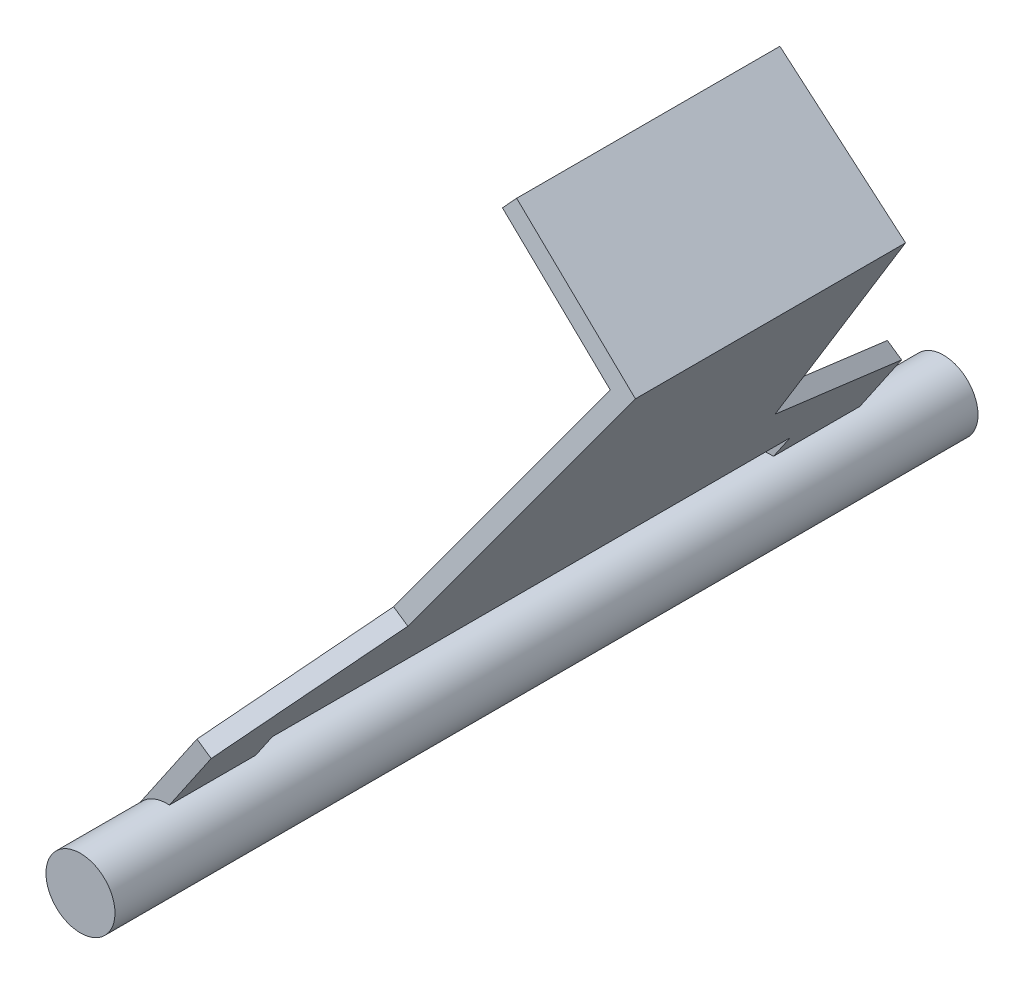
ISO-10303-21;
HEADER;
FILE_DESCRIPTION(('STEP AP214'),'2;1');
FILE_NAME('part.step','',(''),(''),'','','');
FILE_SCHEMA(('AUTOMOTIVE_DESIGN { 1 0 10303 214 1 1 1 1 }'));
ENDSEC;
DATA;
#1=APPLICATION_CONTEXT('core data for automotive mechanical design processes');
#2=APPLICATION_PROTOCOL_DEFINITION('international standard','automotive_design',2000,#1);
#3=PRODUCT_CONTEXT('',#1,'mechanical');
#4=PRODUCT('Part','Part','',(#3));
#5=PRODUCT_RELATED_PRODUCT_CATEGORY('part','',(#4));
#6=PRODUCT_DEFINITION_FORMATION('','',#4);
#7=PRODUCT_DEFINITION_CONTEXT('part definition',#1,'design');
#8=PRODUCT_DEFINITION('design','',#6,#7);
#9=PRODUCT_DEFINITION_SHAPE('','',#8);
#10=(LENGTH_UNIT() NAMED_UNIT(*) SI_UNIT(.MILLI.,.METRE.));
#11=(NAMED_UNIT(*) PLANE_ANGLE_UNIT() SI_UNIT($,.RADIAN.));
#12=(NAMED_UNIT(*) SI_UNIT($,.STERADIAN.) SOLID_ANGLE_UNIT());
#13=UNCERTAINTY_MEASURE_WITH_UNIT(LENGTH_MEASURE(1.E-05),#10,'distance_accuracy_value','');
#14=(GEOMETRIC_REPRESENTATION_CONTEXT(3) GLOBAL_UNCERTAINTY_ASSIGNED_CONTEXT((#13)) GLOBAL_UNIT_ASSIGNED_CONTEXT((#10,
#11,#12)) REPRESENTATION_CONTEXT('',''));
#15=CARTESIAN_POINT('',(0.,0.,0.));
#16=DIRECTION('',(0.,0.,1.));
#17=DIRECTION('',(1.,0.,0.));
#18=AXIS2_PLACEMENT_3D('',#15,#16,#17);
#19=CARTESIAN_POINT('',(-1.65162904796153,1.12788363226429,40.));
#20=DIRECTION('',(-0.825814523980766,0.563941816132145,0.));
#21=DIRECTION('',(-0.563941816132145,-0.825814523980765,0.));
#22=AXIS2_PLACEMENT_3D('',#19,#20,#21);
#23=PLANE('',#22);
#24=DIRECTION('',(0.563941816132145,0.825814523980765,0.));
#25=VECTOR('',#24,1.);
#26=CARTESIAN_POINT('',(-1.65162904796153,1.12788363226429,-30.));
#27=LINE('',#26,#25);
#28=CARTESIAN_POINT('',(0.301922708145551,3.98858905859028,-30.));
#29=VERTEX_POINT('',#28);
#30=CARTESIAN_POINT('',(2.23331576063067,6.81684613872142,-30.));
#31=VERTEX_POINT('',#30);
#32=EDGE_CURVE('E116',#29,#31,#27,.T.);
#33=ORIENTED_EDGE('',*,*,#32,.F.);
#34=DIRECTION('',(0.,0.,-1.));
#35=VECTOR('',#34,1.);
#36=CARTESIAN_POINT('',(0.301922708145551,3.98858905859028,40.));
#37=LINE('',#36,#35);
#38=CARTESIAN_POINT('',(0.301922708145551,3.98858905859028,-40.));
#39=VERTEX_POINT('',#38);
#40=EDGE_CURVE('E206',#29,#39,#37,.T.);
#41=ORIENTED_EDGE('',*,*,#40,.T.);
#42=DIRECTION('',(0.563941816132145,0.825814523980765,0.));
#43=VECTOR('',#42,1.);
#44=CARTESIAN_POINT('',(-1.65162904796153,1.12788363226429,-40.));
#45=LINE('',#44,#43);
#46=CARTESIAN_POINT('',(5.14915459857713,11.0866874469587,-40.));
#47=VERTEX_POINT('',#46);
#48=EDGE_CURVE('E186',#39,#47,#45,.T.);
#49=ORIENTED_EDGE('',*,*,#48,.T.);
#50=DIRECTION('',(-0.202181195497719,-0.296066301419094,-0.933524241437324));
#51=VECTOR('',#50,1.);
#52=CARTESIAN_POINT('',(9.2059057202515,17.0272364550659,-21.2689033505898));
#53=LINE('',#52,#51);
#54=CARTESIAN_POINT('',(9.2059057202515,17.0272364550659,-21.2689033505898));
#55=VERTEX_POINT('',#54);
#56=EDGE_CURVE('E142',#55,#47,#53,.T.);
#57=ORIENTED_EDGE('',*,*,#56,.F.);
#58=DIRECTION('',(-0.557482158372764,-0.816355251685214,-0.15092298082802));
#59=VECTOR('',#58,1.);
#60=CARTESIAN_POINT('',(33.5666738090889,52.7002004517187,-14.6738945597092));
#61=LINE('',#60,#59);
#62=CARTESIAN_POINT('',(29.9538476820553,47.4097179888569,-15.6519679924032));
#63=VERTEX_POINT('',#62);
#64=EDGE_CURVE('E123',#63,#55,#61,.T.);
#65=ORIENTED_EDGE('',*,*,#64,.F.);
#66=DIRECTION('',(0.,0.,-1.));
#67=VECTOR('',#66,1.);
#68=CARTESIAN_POINT('',(29.9538476820553,47.4097179888569,40.));
#69=LINE('',#68,#67);
#70=CARTESIAN_POINT('',(29.9538476820553,47.4097179888569,15.6519679924032));
#71=VERTEX_POINT('',#70);
#72=EDGE_CURVE('E201',#71,#63,#69,.T.);
#73=ORIENTED_EDGE('',*,*,#72,.F.);
#74=DIRECTION('',(0.557482158372764,0.816355251685214,-0.15092298082802));
#75=VECTOR('',#74,1.);
#76=CARTESIAN_POINT('',(33.5666738090889,52.7002004517187,14.6738945597092));
#77=LINE('',#76,#75);
#78=CARTESIAN_POINT('',(9.2059057202515,17.0272364550659,21.2689033505898));
#79=VERTEX_POINT('',#78);
#80=EDGE_CURVE('E150',#79,#71,#77,.T.);
#81=ORIENTED_EDGE('',*,*,#80,.F.);
#82=DIRECTION('',(0.202181195497719,0.296066301419094,-0.933524241437324));
#83=VECTOR('',#82,1.);
#84=CARTESIAN_POINT('',(9.2059057202515,17.0272364550659,21.2689033505898));
#85=LINE('',#84,#83);
#86=CARTESIAN_POINT('',(5.14915459857713,11.0866874469587,40.));
#87=VERTEX_POINT('',#86);
#88=EDGE_CURVE('E145',#87,#79,#85,.T.);
#89=ORIENTED_EDGE('',*,*,#88,.F.);
#90=DIRECTION('',(0.563941816132145,0.825814523980765,0.));
#91=VECTOR('',#90,1.);
#92=CARTESIAN_POINT('',(-1.65162904796153,1.12788363226429,40.));
#93=LINE('',#92,#91);
#94=CARTESIAN_POINT('',(0.301922708145551,3.98858905859028,40.));
#95=VERTEX_POINT('',#94);
#96=EDGE_CURVE('E177',#95,#87,#93,.T.);
#97=ORIENTED_EDGE('',*,*,#96,.F.);
#98=CARTESIAN_POINT('',(0.301922708145551,3.98858905859028,30.));
#99=VERTEX_POINT('',#98);
#100=EDGE_CURVE('E210',#95,#99,#37,.T.);
#101=ORIENTED_EDGE('',*,*,#100,.T.);
#102=DIRECTION('',(0.563941816132145,0.825814523980765,0.));
#103=VECTOR('',#102,1.);
#104=CARTESIAN_POINT('',(-1.65162904796153,1.12788363226429,30.));
#105=LINE('',#104,#103);
#106=CARTESIAN_POINT('',(2.23331576063067,6.81684613872142,30.));
#107=VERTEX_POINT('',#106);
#108=EDGE_CURVE('E130',#99,#107,#105,.T.);
#109=ORIENTED_EDGE('',*,*,#108,.T.);
#110=DIRECTION('',(0.,0.,1.));
#111=VECTOR('',#110,1.);
#112=CARTESIAN_POINT('',(2.23331576063067,6.81684613872142,-30.));
#113=LINE('',#112,#111);
#114=EDGE_CURVE('E129',#31,#107,#113,.T.);
#115=ORIENTED_EDGE('',*,*,#114,.F.);
#116=EDGE_LOOP('',(#33,#41,#49,#57,#65,#73,#81,#89,#97,#101,#109,#115));
#117=FACE_BOUND('',#116,.T.);
#118=ADVANCED_FACE('F16',(#117),#23,.F.);
#119=CARTESIAN_POINT('',(-3.30325809592306,2.25576726452858,40.));
#120=DIRECTION('',(-0.825814523980765,0.563941816132145,0.));
#121=DIRECTION('',(-0.563941816132145,-0.825814523980765,0.));
#122=AXIS2_PLACEMENT_3D('',#119,#120,#121);
#123=PLANE('',#122);
#124=DIRECTION('',(0.,0.,-1.));
#125=VECTOR('',#124,1.);
#126=CARTESIAN_POINT('',(-3.30325809592306,2.25576726452858,40.));
#127=LINE('',#126,#125);
#128=CARTESIAN_POINT('',(-3.30325809592306,2.25576726452858,-30.));
#129=VERTEX_POINT('',#128);
#130=CARTESIAN_POINT('',(-3.30325809592306,2.25576726452858,-40.));
#131=VERTEX_POINT('',#130);
#132=EDGE_CURVE('E183',#129,#131,#127,.T.);
#133=ORIENTED_EDGE('',*,*,#132,.F.);
#134=DIRECTION('',(0.563941816132145,0.825814523980765,0.));
#135=VECTOR('',#134,1.);
#136=CARTESIAN_POINT('',(-3.30325809592306,2.25576726452858,-30.));
#137=LINE('',#136,#135);
#138=CARTESIAN_POINT('',(0.58168671266914,7.94472977098571,-30.));
#139=VERTEX_POINT('',#138);
#140=EDGE_CURVE('E11',#129,#139,#137,.T.);
#141=ORIENTED_EDGE('',*,*,#140,.T.);
#142=DIRECTION('',(0.,0.,-1.));
#143=VECTOR('',#142,1.);
#144=CARTESIAN_POINT('',(0.581686712669141,7.94472977098571,40.));
#145=LINE('',#144,#143);
#146=CARTESIAN_POINT('',(0.58168671266914,7.94472977098571,30.));
#147=VERTEX_POINT('',#146);
#148=EDGE_CURVE('E24',#147,#139,#145,.T.);
#149=ORIENTED_EDGE('',*,*,#148,.F.);
#150=DIRECTION('',(0.563941816132145,0.825814523980765,0.));
#151=VECTOR('',#150,1.);
#152=CARTESIAN_POINT('',(-3.30325809592306,2.25576726452858,30.));
#153=LINE('',#152,#151);
#154=CARTESIAN_POINT('',(-3.30325809592306,2.25576726452858,30.));
#155=VERTEX_POINT('',#154);
#156=EDGE_CURVE('E221',#155,#147,#153,.T.);
#157=ORIENTED_EDGE('',*,*,#156,.F.);
#158=CARTESIAN_POINT('',(-3.30325809592306,2.25576726452858,40.));
#159=VERTEX_POINT('',#158);
#160=EDGE_CURVE('E191',#159,#155,#127,.T.);
#161=ORIENTED_EDGE('',*,*,#160,.F.);
#162=DIRECTION('',(0.563941816132145,0.825814523980765,0.));
#163=VECTOR('',#162,1.);
#164=CARTESIAN_POINT('',(-3.30325809592306,2.25576726452858,40.));
#165=LINE('',#164,#163);
#166=CARTESIAN_POINT('',(3.4975255506156,12.214571079223,40.));
#167=VERTEX_POINT('',#166);
#168=EDGE_CURVE('E178',#159,#167,#165,.T.);
#169=ORIENTED_EDGE('',*,*,#168,.T.);
#170=DIRECTION('',(-0.202181195497719,-0.296066301419094,0.933524241437324));
#171=VECTOR('',#170,1.);
#172=CARTESIAN_POINT('',(2.6234038901619,10.9345412210369,44.0360517108931));
#173=LINE('',#172,#171);
#174=CARTESIAN_POINT('',(7.55427667228997,18.1551200873302,21.2689033505898));
#175=VERTEX_POINT('',#174);
#176=EDGE_CURVE('E154',#175,#167,#173,.T.);
#177=ORIENTED_EDGE('',*,*,#176,.F.);
#178=DIRECTION('',(-0.557482158372764,-0.816355251685214,0.15092298082802));
#179=VECTOR('',#178,1.);
#180=CARTESIAN_POINT('',(-4.63192375213653,0.310120807699056,24.5679823711462));
#181=LINE('',#180,#179);
#182=CARTESIAN_POINT('',(27.3198031283432,47.0989904558825,15.9179300044832));
#183=VERTEX_POINT('',#182);
#184=EDGE_CURVE('E225',#183,#175,#181,.T.);
#185=ORIENTED_EDGE('',*,*,#184,.F.);
#186=DIRECTION('',(0.,0.,-1.));
#187=VECTOR('',#186,1.);
#188=CARTESIAN_POINT('',(27.3198031283432,47.0989904558825,40.));
#189=LINE('',#188,#187);
#190=CARTESIAN_POINT('',(27.3198031283432,47.0989904558825,-15.9179300044831));
#191=VERTEX_POINT('',#190);
#192=EDGE_CURVE('E192',#183,#191,#189,.T.);
#193=ORIENTED_EDGE('',*,*,#192,.T.);
#194=DIRECTION('',(0.557482158372764,0.816355251685214,0.15092298082802));
#195=VECTOR('',#194,1.);
#196=CARTESIAN_POINT('',(2.09902577586795,10.1666622476143,-22.745762679785));
#197=LINE('',#196,#195);
#198=CARTESIAN_POINT('',(7.55427667228995,18.1551200873302,-21.2689033505898));
#199=VERTEX_POINT('',#198);
#200=EDGE_CURVE('E219',#199,#191,#197,.T.);
#201=ORIENTED_EDGE('',*,*,#200,.F.);
#202=DIRECTION('',(0.202181195497719,0.296066301419094,0.933524241437324));
#203=VECTOR('',#202,1.);
#204=CARTESIAN_POINT('',(17.7226876629538,33.04534677683,25.6813490371974));
#205=LINE('',#204,#203);
#206=CARTESIAN_POINT('',(3.4975255506156,12.214571079223,-40.));
#207=VERTEX_POINT('',#206);
#208=EDGE_CURVE('E155',#207,#199,#205,.T.);
#209=ORIENTED_EDGE('',*,*,#208,.F.);
#210=DIRECTION('',(0.563941816132145,0.825814523980765,0.));
#211=VECTOR('',#210,1.);
#212=CARTESIAN_POINT('',(-3.30325809592306,2.25576726452858,-40.));
#213=LINE('',#212,#211);
#214=EDGE_CURVE('E180',#131,#207,#213,.T.);
#215=ORIENTED_EDGE('',*,*,#214,.F.);
#216=EDGE_LOOP('',(#133,#141,#149,#157,#161,#169,#177,#185,#193,#201,#209,#215));
#217=FACE_BOUND('',#216,.T.);
#218=ADVANCED_FACE('F228',(#217),#123,.T.);
#219=CARTESIAN_POINT('',(0.,0.,50.));
#220=DIRECTION('',(0.,0.,-1.));
#221=DIRECTION('',(-1.,0.,0.));
#222=AXIS2_PLACEMENT_3D('',#219,#220,#221);
#223=CYLINDRICAL_SURFACE('',#222,4.);
#224=ORIENTED_EDGE('',*,*,#160,.T.);
#225=CARTESIAN_POINT('',(0.,0.,30.));
#226=DIRECTION('',(0.,0.,1.));
#227=DIRECTION('',(1.,0.,0.));
#228=AXIS2_PLACEMENT_3D('',#225,#226,#227);
#229=CIRCLE('',#228,4.);
#230=EDGE_CURVE('E38',#99,#155,#229,.T.);
#231=ORIENTED_EDGE('',*,*,#230,.F.);
#232=ORIENTED_EDGE('',*,*,#100,.F.);
#233=CARTESIAN_POINT('',(0.,0.,40.));
#234=DIRECTION('',(0.,0.,1.));
#235=DIRECTION('',(1.,0.,0.));
#236=AXIS2_PLACEMENT_3D('',#233,#234,#235);
#237=CIRCLE('',#236,4.);
#238=EDGE_CURVE('E173',#95,#159,#237,.T.);
#239=ORIENTED_EDGE('',*,*,#238,.T.);
#240=EDGE_LOOP('',(#224,#231,#232,#239));
#241=FACE_BOUND('',#240,.T.);
#242=CARTESIAN_POINT('',(0.,0.,50.));
#243=DIRECTION('',(0.,0.,1.));
#244=DIRECTION('',(1.,0.,0.));
#245=AXIS2_PLACEMENT_3D('',#242,#243,#244);
#246=CIRCLE('',#245,4.);
#247=CARTESIAN_POINT('',(4.,0.,50.));
#248=VERTEX_POINT('',#247);
#249=EDGE_CURVE('E209',#248,#248,#246,.T.);
#250=ORIENTED_EDGE('',*,*,#249,.F.);
#251=EDGE_LOOP('',(#250));
#252=FACE_BOUND('',#251,.T.);
#253=CARTESIAN_POINT('',(0.,0.,-30.));
#254=DIRECTION('',(0.,0.,1.));
#255=DIRECTION('',(1.,0.,0.));
#256=AXIS2_PLACEMENT_3D('',#253,#254,#255);
#257=CIRCLE('',#256,4.);
#258=EDGE_CURVE('E122',#29,#129,#257,.T.);
#259=ORIENTED_EDGE('',*,*,#258,.T.);
#260=ORIENTED_EDGE('',*,*,#132,.T.);
#261=CARTESIAN_POINT('',(0.,0.,-40.));
#262=DIRECTION('',(0.,0.,1.));
#263=DIRECTION('',(1.,0.,0.));
#264=AXIS2_PLACEMENT_3D('',#261,#262,#263);
#265=CIRCLE('',#264,4.);
#266=EDGE_CURVE('E174',#39,#131,#265,.T.);
#267=ORIENTED_EDGE('',*,*,#266,.F.);
#268=ORIENTED_EDGE('',*,*,#40,.F.);
#269=EDGE_LOOP('',(#259,#260,#267,#268));
#270=FACE_BOUND('',#269,.T.);
#271=CARTESIAN_POINT('',(0.,0.,-50.));
#272=DIRECTION('',(0.,0.,1.));
#273=DIRECTION('',(1.,0.,0.));
#274=AXIS2_PLACEMENT_3D('',#271,#272,#273);
#275=CIRCLE('',#274,4.);
#276=CARTESIAN_POINT('',(4.,0.,-50.));
#277=VERTEX_POINT('',#276);
#278=EDGE_CURVE('E207',#277,#277,#275,.T.);
#279=ORIENTED_EDGE('',*,*,#278,.T.);
#280=EDGE_LOOP('',(#279));
#281=FACE_BOUND('',#280,.T.);
#282=ADVANCED_FACE('F18',(#241,#252,#270,#281),#223,.T.);
#283=CARTESIAN_POINT('',(0.,0.,50.));
#284=DIRECTION('',(0.,0.,1.));
#285=DIRECTION('',(1.,0.,0.));
#286=AXIS2_PLACEMENT_3D('',#283,#284,#285);
#287=PLANE('',#286);
#288=ORIENTED_EDGE('',*,*,#249,.T.);
#289=EDGE_LOOP('',(#288));
#290=FACE_BOUND('',#289,.T.);
#291=ADVANCED_FACE('F280',(#290),#287,.T.);
#292=CARTESIAN_POINT('',(0.,0.,-50.));
#293=DIRECTION('',(0.,0.,1.));
#294=DIRECTION('',(1.,0.,0.));
#295=AXIS2_PLACEMENT_3D('',#292,#293,#294);
#296=PLANE('',#295);
#297=ORIENTED_EDGE('',*,*,#278,.F.);
#298=EDGE_LOOP('',(#297));
#299=FACE_BOUND('',#298,.T.);
#300=ADVANCED_FACE('F281',(#299),#296,.F.);
#301=CARTESIAN_POINT('',(37.1164369712877,40.9115596090355,40.));
#302=DIRECTION('',(-0.671920254283912,-0.74062350211362,0.));
#303=DIRECTION('',(0.74062350211362,-0.671920254283912,0.));
#304=AXIS2_PLACEMENT_3D('',#301,#302,#303);
#305=PLANE('',#304);
#306=DIRECTION('',(0.,0.,-1.));
#307=VECTOR('',#306,1.);
#308=CARTESIAN_POINT('',(15.7936550696375,60.2563535515849,40.));
#309=LINE('',#308,#307);
#310=CARTESIAN_POINT('',(15.7936550696375,60.2563535515849,15.2514468483787));
#311=VERTEX_POINT('',#310);
#312=CARTESIAN_POINT('',(15.7936550696375,60.2563535515849,-15.2514468483787));
#313=VERTEX_POINT('',#312);
#314=EDGE_CURVE('E199',#311,#313,#309,.T.);
#315=ORIENTED_EDGE('',*,*,#314,.F.);
#316=DIRECTION('',(0.74046104746781,-0.671772869591675,0.0209439457467055));
#317=VECTOR('',#316,1.);
#318=CARTESIAN_POINT('',(37.4908886754033,40.5718435677158,15.8651532479884));
#319=LINE('',#318,#317);
#320=EDGE_CURVE('E168',#311,#71,#319,.T.);
#321=ORIENTED_EDGE('',*,*,#320,.T.);
#322=ORIENTED_EDGE('',*,*,#72,.T.);
#323=DIRECTION('',(-0.74046104746781,0.671772869591675,0.0209439457467055));
#324=VECTOR('',#323,1.);
#325=CARTESIAN_POINT('',(36.2502345949461,41.6974095305028,-15.8300613389132));
#326=LINE('',#325,#324);
#327=EDGE_CURVE('E165',#63,#313,#326,.T.);
#328=ORIENTED_EDGE('',*,*,#327,.T.);
#329=EDGE_LOOP('',(#315,#321,#322,#328));
#330=FACE_BOUND('',#329,.T.);
#331=ADVANCED_FACE('F256',(#330),#305,.F.);
#332=CARTESIAN_POINT('',(-21.3227819016502,19.3447939425493,40.));
#333=DIRECTION('',(0.740623502113621,-0.671920254283911,0.));
#334=DIRECTION('',(0.671920254283911,0.740623502113621,0.));
#335=AXIS2_PLACEMENT_3D('',#332,#333,#334);
#336=PLANE('',#335);
#337=DIRECTION('',(0.,0.,-1.));
#338=VECTOR('',#337,1.);
#339=CARTESIAN_POINT('',(14.4498145610696,58.7751065473576,40.));
#340=LINE('',#339,#338);
#341=CARTESIAN_POINT('',(14.4498145610696,58.7751065473576,15.553902290621));
#342=VERTEX_POINT('',#341);
#343=CARTESIAN_POINT('',(14.4498145610696,58.7751065473576,-15.553902290621));
#344=VERTEX_POINT('',#343);
#345=EDGE_CURVE('E197',#342,#344,#340,.T.);
#346=ORIENTED_EDGE('',*,*,#345,.F.);
#347=DIRECTION('',(0.664366230666714,0.732297086306466,-0.149527552433532));
#348=VECTOR('',#347,1.);
#349=CARTESIAN_POINT('',(-22.9514618704887,17.5495828968145,23.9717312899796));
#350=LINE('',#349,#348);
#351=EDGE_CURVE('E170',#342,#311,#350,.T.);
#352=ORIENTED_EDGE('',*,*,#351,.T.);
#353=ORIENTED_EDGE('',*,*,#314,.T.);
#354=DIRECTION('',(-0.664366230666714,-0.732297086306466,-0.149527552433532));
#355=VECTOR('',#354,1.);
#356=CARTESIAN_POINT('',(-15.0041773592018,26.3094701743836,-22.1830521750387));
#357=LINE('',#356,#355);
#358=EDGE_CURVE('E157',#313,#344,#357,.T.);
#359=ORIENTED_EDGE('',*,*,#358,.T.);
#360=EDGE_LOOP('',(#346,#352,#353,#359));
#361=FACE_BOUND('',#360,.T.);
#362=ADVANCED_FACE('F254',(#361),#336,.F.);
#363=CARTESIAN_POINT('',(35.7725964627199,39.4303126048083,40.));
#364=DIRECTION('',(-0.671920254283912,-0.74062350211362,0.));
#365=DIRECTION('',(0.74062350211362,-0.671920254283912,0.));
#366=AXIS2_PLACEMENT_3D('',#363,#364,#365);
#367=PLANE('',#366);
#368=DIRECTION('',(0.74046104746781,-0.671772869591675,0.0209439457467055));
#369=VECTOR('',#368,1.);
#370=CARTESIAN_POINT('',(36.1423576346033,39.0948519828767,16.1674760184948));
#371=LINE('',#370,#369);
#372=EDGE_CURVE('E164',#342,#183,#371,.T.);
#373=ORIENTED_EDGE('',*,*,#372,.F.);
#374=ORIENTED_EDGE('',*,*,#345,.T.);
#375=DIRECTION('',(-0.74046104746781,0.671772869591675,0.0209439457467055));
#376=VECTOR('',#375,1.);
#377=CARTESIAN_POINT('',(34.9017035541462,40.2204179456637,-16.1323841094195));
#378=LINE('',#377,#376);
#379=EDGE_CURVE('E160',#191,#344,#378,.T.);
#380=ORIENTED_EDGE('',*,*,#379,.F.);
#381=ORIENTED_EDGE('',*,*,#192,.F.);
#382=EDGE_LOOP('',(#373,#374,#380,#381));
#383=FACE_BOUND('',#382,.T.);
#384=ADVANCED_FACE('F252',(#383),#367,.T.);
#385=CARTESIAN_POINT('',(0.,0.,40.));
#386=DIRECTION('',(0.,0.,1.));
#387=DIRECTION('',(1.,0.,0.));
#388=AXIS2_PLACEMENT_3D('',#385,#386,#387);
#389=PLANE('',#388);
#390=DIRECTION('',(0.825814523980765,-0.563941816132145,0.));
#391=VECTOR('',#390,1.);
#392=CARTESIAN_POINT('',(6.80078364653866,9.95880381469441,40.));
#393=LINE('',#392,#391);
#394=EDGE_CURVE('E217',#167,#87,#393,.T.);
#395=ORIENTED_EDGE('',*,*,#394,.F.);
#396=ORIENTED_EDGE('',*,*,#168,.F.);
#397=ORIENTED_EDGE('',*,*,#238,.F.);
#398=ORIENTED_EDGE('',*,*,#96,.T.);
#399=EDGE_LOOP('',(#395,#396,#397,#398));
#400=FACE_BOUND('',#399,.T.);
#401=ADVANCED_FACE('F275',(#400),#389,.T.);
#402=CARTESIAN_POINT('',(0.,0.,-40.));
#403=DIRECTION('',(0.,0.,1.));
#404=DIRECTION('',(1.,0.,0.));
#405=AXIS2_PLACEMENT_3D('',#402,#403,#404);
#406=PLANE('',#405);
#407=ORIENTED_EDGE('',*,*,#214,.T.);
#408=DIRECTION('',(0.825814523980765,-0.563941816132145,0.));
#409=VECTOR('',#408,1.);
#410=CARTESIAN_POINT('',(6.80078364653866,9.95880381469441,-40.));
#411=LINE('',#410,#409);
#412=EDGE_CURVE('E213',#207,#47,#411,.T.);
#413=ORIENTED_EDGE('',*,*,#412,.T.);
#414=ORIENTED_EDGE('',*,*,#48,.F.);
#415=ORIENTED_EDGE('',*,*,#266,.T.);
#416=EDGE_LOOP('',(#407,#413,#414,#415));
#417=FACE_BOUND('',#416,.T.);
#418=ADVANCED_FACE('F237',(#417),#406,.F.);
#419=CARTESIAN_POINT('',(-56.8592561982097,62.1425817456374,-21.2689033505898));
#420=DIRECTION('',(-0.526453356119548,-0.770917877067069,0.358514282349907));
#421=DIRECTION('',(0.825814523980765,-0.563941816132145,0.));
#422=AXIS2_PLACEMENT_3D('',#419,#420,#421);
#423=PLANE('',#422);
#424=ORIENTED_EDGE('',*,*,#208,.T.);
#425=DIRECTION('',(0.825814523980765,-0.563941816132145,0.));
#426=VECTOR('',#425,1.);
#427=CARTESIAN_POINT('',(-56.8592561982097,62.1425817456374,-21.2689033505898));
#428=LINE('',#427,#426);
#429=EDGE_CURVE('E149',#199,#55,#428,.T.);
#430=ORIENTED_EDGE('',*,*,#429,.T.);
#431=ORIENTED_EDGE('',*,*,#56,.T.);
#432=ORIENTED_EDGE('',*,*,#412,.F.);
#433=EDGE_LOOP('',(#424,#430,#431,#432));
#434=FACE_BOUND('',#433,.T.);
#435=ADVANCED_FACE('F245',(#434),#423,.F.);
#436=CARTESIAN_POINT('',(-32.4984881093724,97.8155457422903,-14.6738945597092));
#437=DIRECTION('',(-0.0851117799042305,-0.124634389570249,0.988545524423628));
#438=DIRECTION('',(0.,-0.992145614948804,-0.125088283775339));
#439=AXIS2_PLACEMENT_3D('',#436,#437,#438);
#440=PLANE('',#439);
#441=ORIENTED_EDGE('',*,*,#64,.T.);
#442=ORIENTED_EDGE('',*,*,#429,.F.);
#443=ORIENTED_EDGE('',*,*,#200,.T.);
#444=ORIENTED_EDGE('',*,*,#379,.T.);
#445=ORIENTED_EDGE('',*,*,#358,.F.);
#446=ORIENTED_EDGE('',*,*,#327,.F.);
#447=EDGE_LOOP('',(#441,#442,#443,#444,#445,#446));
#448=FACE_BOUND('',#447,.T.);
#449=ADVANCED_FACE('F247',(#448),#440,.F.);
#450=CARTESIAN_POINT('',(-32.4984881093724,97.8155457422903,14.6738945597092));
#451=DIRECTION('',(-0.0851117799042305,-0.124634389570249,-0.988545524423628));
#452=DIRECTION('',(0.,0.992145614948804,-0.125088283775339));
#453=AXIS2_PLACEMENT_3D('',#450,#451,#452);
#454=PLANE('',#453);
#455=ORIENTED_EDGE('',*,*,#351,.F.);
#456=ORIENTED_EDGE('',*,*,#372,.T.);
#457=ORIENTED_EDGE('',*,*,#184,.T.);
#458=DIRECTION('',(0.825814523980765,-0.563941816132145,0.));
#459=VECTOR('',#458,1.);
#460=CARTESIAN_POINT('',(-56.8592561982097,62.1425817456374,21.2689033505898));
#461=LINE('',#460,#459);
#462=EDGE_CURVE('E147',#175,#79,#461,.T.);
#463=ORIENTED_EDGE('',*,*,#462,.T.);
#464=ORIENTED_EDGE('',*,*,#80,.T.);
#465=ORIENTED_EDGE('',*,*,#320,.F.);
#466=EDGE_LOOP('',(#455,#456,#457,#463,#464,#465));
#467=FACE_BOUND('',#466,.T.);
#468=ADVANCED_FACE('F262',(#467),#454,.F.);
#469=CARTESIAN_POINT('',(-56.8592561982097,62.1425817456374,21.2689033505898));
#470=DIRECTION('',(-0.526453356119548,-0.770917877067069,-0.358514282349907));
#471=DIRECTION('',(0.825814523980765,-0.563941816132145,0.));
#472=AXIS2_PLACEMENT_3D('',#469,#470,#471);
#473=PLANE('',#472);
#474=ORIENTED_EDGE('',*,*,#176,.T.);
#475=ORIENTED_EDGE('',*,*,#394,.T.);
#476=ORIENTED_EDGE('',*,*,#88,.T.);
#477=ORIENTED_EDGE('',*,*,#462,.F.);
#478=EDGE_LOOP('',(#474,#475,#476,#477));
#479=FACE_BOUND('',#478,.T.);
#480=ADVANCED_FACE('F268',(#479),#473,.F.);
#481=CARTESIAN_POINT('',(0.,0.,-30.));
#482=DIRECTION('',(0.,0.,1.));
#483=DIRECTION('',(1.,0.,0.));
#484=AXIS2_PLACEMENT_3D('',#481,#482,#483);
#485=PLANE('',#484);
#486=ORIENTED_EDGE('',*,*,#32,.T.);
#487=DIRECTION('',(-0.825814523980766,0.563941816132145,0.));
#488=VECTOR('',#487,1.);
#489=CARTESIAN_POINT('',(3.8849448085922,5.68896250645713,-30.));
#490=LINE('',#489,#488);
#491=EDGE_CURVE('E118',#31,#139,#490,.T.);
#492=ORIENTED_EDGE('',*,*,#491,.T.);
#493=ORIENTED_EDGE('',*,*,#140,.F.);
#494=ORIENTED_EDGE('',*,*,#258,.F.);
#495=EDGE_LOOP('',(#486,#492,#493,#494));
#496=FACE_BOUND('',#495,.T.);
#497=ADVANCED_FACE('F119',(#496),#485,.T.);
#498=CARTESIAN_POINT('',(0.,0.,30.));
#499=DIRECTION('',(0.,0.,1.));
#500=DIRECTION('',(1.,0.,0.));
#501=AXIS2_PLACEMENT_3D('',#498,#499,#500);
#502=PLANE('',#501);
#503=ORIENTED_EDGE('',*,*,#230,.T.);
#504=ORIENTED_EDGE('',*,*,#156,.T.);
#505=DIRECTION('',(-0.825814523980766,0.563941816132145,0.));
#506=VECTOR('',#505,1.);
#507=CARTESIAN_POINT('',(3.8849448085922,5.68896250645713,30.));
#508=LINE('',#507,#506);
#509=EDGE_CURVE('E33',#107,#147,#508,.T.);
#510=ORIENTED_EDGE('',*,*,#509,.F.);
#511=ORIENTED_EDGE('',*,*,#108,.F.);
#512=EDGE_LOOP('',(#503,#504,#510,#511));
#513=FACE_BOUND('',#512,.T.);
#514=ADVANCED_FACE('F223',(#513),#502,.F.);
#515=CARTESIAN_POINT('',(3.8849448085922,5.68896250645713,-30.));
#516=DIRECTION('',(0.563941816132145,0.825814523980765,0.));
#517=DIRECTION('',(-0.825814523980765,0.563941816132145,0.));
#518=AXIS2_PLACEMENT_3D('',#515,#516,#517);
#519=PLANE('',#518);
#520=ORIENTED_EDGE('',*,*,#148,.T.);
#521=ORIENTED_EDGE('',*,*,#491,.F.);
#522=ORIENTED_EDGE('',*,*,#114,.T.);
#523=ORIENTED_EDGE('',*,*,#509,.T.);
#524=EDGE_LOOP('',(#520,#521,#522,#523));
#525=FACE_BOUND('',#524,.T.);
#526=ADVANCED_FACE('F127',(#525),#519,.F.);
#527=CLOSED_SHELL('',(#118,#218,#282,#291,#300,#331,#362,#384,#401,#418,#435,#449,#468,#480,
#497,#514,#526));
#528=MANIFOLD_SOLID_BREP('B1',#527);
#529=ADVANCED_BREP_SHAPE_REPRESENTATION('',(#18,#528),#14);
#530=SHAPE_DEFINITION_REPRESENTATION(#9,#529);
ENDSEC;
END-ISO-10303-21;
